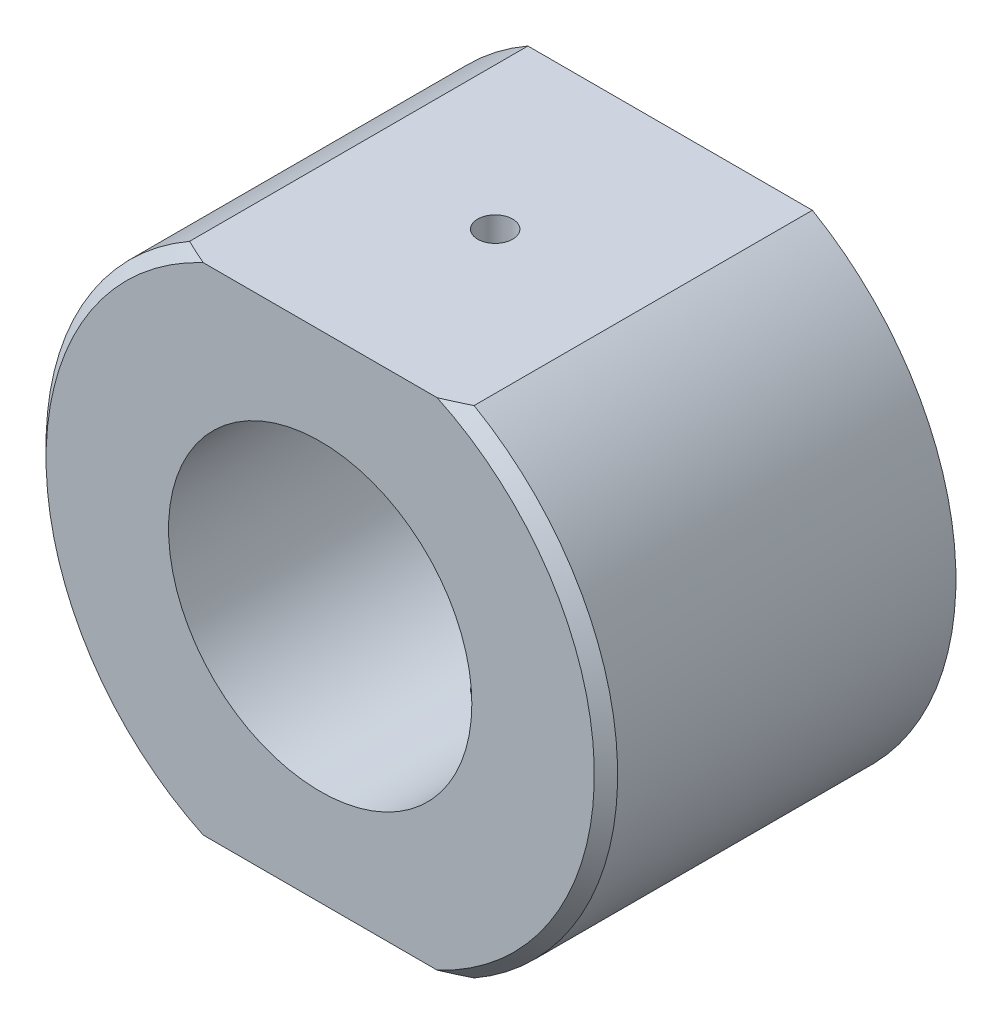
ISO-10303-21;
HEADER;
FILE_DESCRIPTION(('STEP AP214'),'2;1');
FILE_NAME('part.step','',(''),(''),'','','');
FILE_SCHEMA(('AUTOMOTIVE_DESIGN { 1 0 10303 214 1 1 1 1 }'));
ENDSEC;
DATA;
#1=APPLICATION_CONTEXT('core data for automotive mechanical design processes');
#2=APPLICATION_PROTOCOL_DEFINITION('international standard','automotive_design',2000,#1);
#3=PRODUCT_CONTEXT('',#1,'mechanical');
#4=PRODUCT('Part','Part','',(#3));
#5=PRODUCT_RELATED_PRODUCT_CATEGORY('part','',(#4));
#6=PRODUCT_DEFINITION_FORMATION('','',#4);
#7=PRODUCT_DEFINITION_CONTEXT('part definition',#1,'design');
#8=PRODUCT_DEFINITION('design','',#6,#7);
#9=PRODUCT_DEFINITION_SHAPE('','',#8);
#10=(LENGTH_UNIT() NAMED_UNIT(*) SI_UNIT(.MILLI.,.METRE.));
#11=(NAMED_UNIT(*) PLANE_ANGLE_UNIT() SI_UNIT($,.RADIAN.));
#12=(NAMED_UNIT(*) SI_UNIT($,.STERADIAN.) SOLID_ANGLE_UNIT());
#13=UNCERTAINTY_MEASURE_WITH_UNIT(LENGTH_MEASURE(1.E-05),#10,'distance_accuracy_value','');
#14=(GEOMETRIC_REPRESENTATION_CONTEXT(3) GLOBAL_UNCERTAINTY_ASSIGNED_CONTEXT((#13)) GLOBAL_UNIT_ASSIGNED_CONTEXT((#10,
#11,#12)) REPRESENTATION_CONTEXT('',''));
#15=CARTESIAN_POINT('',(0.,0.,0.));
#16=DIRECTION('',(0.,0.,1.));
#17=DIRECTION('',(1.,0.,0.));
#18=AXIS2_PLACEMENT_3D('',#15,#16,#17);
#19=CARTESIAN_POINT('',(0.,0.,60.));
#20=DIRECTION('',(0.,0.,1.));
#21=DIRECTION('',(1.,0.,0.));
#22=AXIS2_PLACEMENT_3D('',#19,#20,#21);
#23=PLANE('',#22);
#24=DIRECTION('',(1.,0.,0.));
#25=VECTOR('',#24,1.);
#26=CARTESIAN_POINT('',(24.3874967965144,-42.5,60.));
#27=LINE('',#26,#25);
#28=CARTESIAN_POINT('',(-20.0686322403894,-42.5,60.));
#29=VERTEX_POINT('',#28);
#30=CARTESIAN_POINT('',(20.0686322403894,-42.5,60.));
#31=VERTEX_POINT('',#30);
#32=EDGE_CURVE('E135',#29,#31,#27,.T.);
#33=ORIENTED_EDGE('',*,*,#32,.T.);
#34=CARTESIAN_POINT('',(0.,0.,60.));
#35=DIRECTION('',(0.,0.,1.));
#36=DIRECTION('',(1.,0.,0.));
#37=AXIS2_PLACEMENT_3D('',#34,#35,#36);
#38=CIRCLE('',#37,47.);
#39=CARTESIAN_POINT('',(20.0686322403894,42.5,60.));
#40=VERTEX_POINT('',#39);
#41=EDGE_CURVE('E142',#31,#40,#38,.T.);
#42=ORIENTED_EDGE('',*,*,#41,.T.);
#43=DIRECTION('',(-1.,0.,0.));
#44=VECTOR('',#43,1.);
#45=CARTESIAN_POINT('',(-24.3874967965144,42.5,60.));
#46=LINE('',#45,#44);
#47=CARTESIAN_POINT('',(-20.0686322403894,42.5,60.));
#48=VERTEX_POINT('',#47);
#49=EDGE_CURVE('E129',#40,#48,#46,.T.);
#50=ORIENTED_EDGE('',*,*,#49,.T.);
#51=CARTESIAN_POINT('',(0.,0.,60.));
#52=DIRECTION('',(0.,0.,1.));
#53=DIRECTION('',(1.,0.,0.));
#54=AXIS2_PLACEMENT_3D('',#51,#52,#53);
#55=CIRCLE('',#54,47.);
#56=EDGE_CURVE('E107',#48,#29,#55,.T.);
#57=ORIENTED_EDGE('',*,*,#56,.T.);
#58=EDGE_LOOP('',(#33,#42,#50,#57));
#59=FACE_BOUND('',#58,.T.);
#60=CARTESIAN_POINT('',(0.,0.,60.));
#61=DIRECTION('',(0.,0.,1.));
#62=DIRECTION('',(1.,0.,0.));
#63=AXIS2_PLACEMENT_3D('',#60,#61,#62);
#64=CIRCLE('',#63,26.);
#65=CARTESIAN_POINT('',(26.,0.,60.));
#66=VERTEX_POINT('',#65);
#67=EDGE_CURVE('E123',#66,#66,#64,.T.);
#68=ORIENTED_EDGE('',*,*,#67,.F.);
#69=EDGE_LOOP('',(#68));
#70=FACE_BOUND('',#69,.T.);
#71=ADVANCED_FACE('F39',(#59,#70),#23,.T.);
#72=CARTESIAN_POINT('',(0.,0.,0.));
#73=DIRECTION('',(0.,0.,1.));
#74=DIRECTION('',(1.,0.,0.));
#75=AXIS2_PLACEMENT_3D('',#72,#73,#74);
#76=PLANE('',#75);
#77=CARTESIAN_POINT('',(0.,0.,0.));
#78=DIRECTION('',(0.,0.,1.));
#79=DIRECTION('',(1.,0.,0.));
#80=AXIS2_PLACEMENT_3D('',#77,#78,#79);
#81=CIRCLE('',#80,49.);
#82=CARTESIAN_POINT('',(-24.3874967965144,42.5,0.));
#83=VERTEX_POINT('',#82);
#84=CARTESIAN_POINT('',(-24.3874967965143,-42.5,0.));
#85=VERTEX_POINT('',#84);
#86=EDGE_CURVE('E115',#83,#85,#81,.T.);
#87=ORIENTED_EDGE('',*,*,#86,.F.);
#88=DIRECTION('',(-1.,0.,0.));
#89=VECTOR('',#88,1.);
#90=CARTESIAN_POINT('',(-24.3874967965144,42.5,0.));
#91=LINE('',#90,#89);
#92=CARTESIAN_POINT('',(24.3874967965144,42.5,0.));
#93=VERTEX_POINT('',#92);
#94=EDGE_CURVE('E133',#93,#83,#91,.T.);
#95=ORIENTED_EDGE('',*,*,#94,.F.);
#96=CARTESIAN_POINT('',(0.,0.,0.));
#97=DIRECTION('',(0.,0.,1.));
#98=DIRECTION('',(1.,0.,0.));
#99=AXIS2_PLACEMENT_3D('',#96,#97,#98);
#100=CIRCLE('',#99,49.);
#101=CARTESIAN_POINT('',(24.3874967965144,-42.5,0.));
#102=VERTEX_POINT('',#101);
#103=EDGE_CURVE('E117',#102,#93,#100,.T.);
#104=ORIENTED_EDGE('',*,*,#103,.F.);
#105=DIRECTION('',(1.,0.,0.));
#106=VECTOR('',#105,1.);
#107=CARTESIAN_POINT('',(24.3874967965144,-42.5,0.));
#108=LINE('',#107,#106);
#109=EDGE_CURVE('E102',#85,#102,#108,.T.);
#110=ORIENTED_EDGE('',*,*,#109,.F.);
#111=EDGE_LOOP('',(#87,#95,#104,#110));
#112=FACE_BOUND('',#111,.T.);
#113=CARTESIAN_POINT('',(0.,0.,0.));
#114=DIRECTION('',(0.,0.,1.));
#115=DIRECTION('',(1.,0.,0.));
#116=AXIS2_PLACEMENT_3D('',#113,#114,#115);
#117=CIRCLE('',#116,26.);
#118=CARTESIAN_POINT('',(26.,0.,0.));
#119=VERTEX_POINT('',#118);
#120=EDGE_CURVE('E126',#119,#119,#117,.T.);
#121=ORIENTED_EDGE('',*,*,#120,.T.);
#122=EDGE_LOOP('',(#121));
#123=FACE_BOUND('',#122,.T.);
#124=ADVANCED_FACE('F112',(#112,#123),#76,.F.);
#125=CARTESIAN_POINT('',(0.,0.,60.));
#126=DIRECTION('',(0.,0.,-1.));
#127=DIRECTION('',(-1.,0.,0.));
#128=AXIS2_PLACEMENT_3D('',#125,#126,#127);
#129=CYLINDRICAL_SURFACE('',#128,49.);
#130=DIRECTION('',(0.,0.,-1.));
#131=VECTOR('',#130,1.);
#132=CARTESIAN_POINT('',(-24.3874967965143,-42.5,60.));
#133=LINE('',#132,#131);
#134=CARTESIAN_POINT('',(-24.3874967965143,-42.5,58.));
#135=VERTEX_POINT('',#134);
#136=EDGE_CURVE('E99',#135,#85,#133,.T.);
#137=ORIENTED_EDGE('',*,*,#136,.F.);
#138=CARTESIAN_POINT('',(0.,0.,58.));
#139=DIRECTION('',(0.,0.,1.));
#140=DIRECTION('',(1.,0.,0.));
#141=AXIS2_PLACEMENT_3D('',#138,#139,#140);
#142=CIRCLE('',#141,49.);
#143=CARTESIAN_POINT('',(-24.3874967965144,42.5,58.));
#144=VERTEX_POINT('',#143);
#145=EDGE_CURVE('E11',#135,#144,#142,.F.);
#146=ORIENTED_EDGE('',*,*,#145,.T.);
#147=DIRECTION('',(0.,0.,-1.));
#148=VECTOR('',#147,1.);
#149=CARTESIAN_POINT('',(-24.3874967965144,42.5,60.));
#150=LINE('',#149,#148);
#151=EDGE_CURVE('E121',#144,#83,#150,.T.);
#152=ORIENTED_EDGE('',*,*,#151,.T.);
#153=ORIENTED_EDGE('',*,*,#86,.T.);
#154=EDGE_LOOP('',(#137,#146,#152,#153));
#155=FACE_BOUND('',#154,.T.);
#156=ADVANCED_FACE('F119',(#155),#129,.T.);
#157=CARTESIAN_POINT('',(24.3874967965144,-42.5,60.));
#158=DIRECTION('',(0.,1.,0.));
#159=DIRECTION('',(0.,0.,1.));
#160=AXIS2_PLACEMENT_3D('',#157,#158,#159);
#161=PLANE('',#160);
#162=CARTESIAN_POINT('',(0.,-42.5,30.));
#163=DIRECTION('',(0.,1.,0.));
#164=DIRECTION('',(-1.,0.,0.));
#165=AXIS2_PLACEMENT_3D('',#162,#163,#164);
#166=CIRCLE('',#165,3.);
#167=CARTESIAN_POINT('',(-2.99999999999998,-42.5,30.));
#168=VERTEX_POINT('',#167);
#169=EDGE_CURVE('E216',#168,#168,#166,.T.);
#170=ORIENTED_EDGE('',*,*,#169,.T.);
#171=EDGE_LOOP('',(#170));
#172=FACE_BOUND('',#171,.T.);
#173=DIRECTION('',(0.,0.,-1.));
#174=VECTOR('',#173,1.);
#175=CARTESIAN_POINT('',(24.3874967965144,-42.5,60.));
#176=LINE('',#175,#174);
#177=CARTESIAN_POINT('',(24.3874967965144,-42.5,58.));
#178=VERTEX_POINT('',#177);
#179=EDGE_CURVE('E108',#178,#102,#176,.T.);
#180=ORIENTED_EDGE('',*,*,#179,.F.);
#181=CARTESIAN_POINT('',(24.3874967965144,-42.5,58.));
#182=CARTESIAN_POINT('',(24.0323372337801,-42.5,58.1767620490189));
#183=CARTESIAN_POINT('',(23.6760171642293,-42.5,58.3512013810915));
#184=CARTESIAN_POINT('',(22.961078025307,-42.5,58.6951053028431));
#185=CARTESIAN_POINT('',(22.602459458859,-42.5,58.8645709383694));
#186=CARTESIAN_POINT('',(21.882789797981,-42.5,59.1982756671127));
#187=CARTESIAN_POINT('',(21.5217386688866,-42.5,59.3625146856579));
#188=CARTESIAN_POINT('',(20.7970887080778,-42.5,59.6854808569935));
#189=CARTESIAN_POINT('',(20.4334893528166,-42.5,59.8442068346773));
#190=CARTESIAN_POINT('',(20.0686322403894,-42.5,60.));
#191=B_SPLINE_CURVE_WITH_KNOTS('',3,(#181,#182,#183,#184,#185,#186,#187,#188,#189,#190),
.UNSPECIFIED.,.F.,.F.,(4,2,2,2,4),(0.,1.19014361104329,2.38003514426986,3.56994366962464,
4.76010428704089),.UNSPECIFIED.);
#192=EDGE_CURVE('E55',#178,#31,#191,.T.);
#193=ORIENTED_EDGE('',*,*,#192,.T.);
#194=ORIENTED_EDGE('',*,*,#32,.F.);
#195=CARTESIAN_POINT('',(-20.0686322403894,-42.5,60.));
#196=CARTESIAN_POINT('',(-20.4334893528166,-42.5,59.8442068346773));
#197=CARTESIAN_POINT('',(-20.7970887080777,-42.5,59.6854808569935));
#198=CARTESIAN_POINT('',(-21.5217386688866,-42.5,59.3625146856579));
#199=CARTESIAN_POINT('',(-21.882789797981,-42.5,59.1982756671127));
#200=CARTESIAN_POINT('',(-22.602459458859,-42.5,58.8645709383694));
#201=CARTESIAN_POINT('',(-22.9610780253069,-42.5,58.6951053028431));
#202=CARTESIAN_POINT('',(-23.6760171642293,-42.5,58.3512013810915));
#203=CARTESIAN_POINT('',(-24.0323372337801,-42.5,58.1767620490189));
#204=CARTESIAN_POINT('',(-24.3874967965144,-42.5,58.));
#205=B_SPLINE_CURVE_WITH_KNOTS('',3,(#195,#196,#197,#198,#199,#200,#201,#202,#203,#204),
.UNSPECIFIED.,.F.,.F.,(4,2,2,2,4),(0.,1.19016061741624,2.38006914277104,3.5699606759976,
4.7601042870409),.UNSPECIFIED.);
#206=EDGE_CURVE('E63',#29,#135,#205,.T.);
#207=ORIENTED_EDGE('',*,*,#206,.T.);
#208=ORIENTED_EDGE('',*,*,#136,.T.);
#209=ORIENTED_EDGE('',*,*,#109,.T.);
#210=EDGE_LOOP('',(#180,#193,#194,#207,#208,#209));
#211=FACE_BOUND('',#210,.T.);
#212=ADVANCED_FACE('F101',(#172,#211),#161,.F.);
#213=CARTESIAN_POINT('',(0.,0.,60.));
#214=DIRECTION('',(0.,0.,-1.));
#215=DIRECTION('',(-1.,0.,0.));
#216=AXIS2_PLACEMENT_3D('',#213,#214,#215);
#217=CYLINDRICAL_SURFACE('',#216,49.);
#218=DIRECTION('',(0.,0.,-1.));
#219=VECTOR('',#218,1.);
#220=CARTESIAN_POINT('',(24.3874967965144,42.5,60.));
#221=LINE('',#220,#219);
#222=CARTESIAN_POINT('',(24.3874967965144,42.5,58.));
#223=VERTEX_POINT('',#222);
#224=EDGE_CURVE('E137',#223,#93,#221,.T.);
#225=ORIENTED_EDGE('',*,*,#224,.F.);
#226=CARTESIAN_POINT('',(0.,0.,58.));
#227=DIRECTION('',(0.,0.,1.));
#228=DIRECTION('',(1.,0.,0.));
#229=AXIS2_PLACEMENT_3D('',#226,#227,#228);
#230=CIRCLE('',#229,49.);
#231=EDGE_CURVE('E71',#223,#178,#230,.F.);
#232=ORIENTED_EDGE('',*,*,#231,.T.);
#233=ORIENTED_EDGE('',*,*,#179,.T.);
#234=ORIENTED_EDGE('',*,*,#103,.T.);
#235=EDGE_LOOP('',(#225,#232,#233,#234));
#236=FACE_BOUND('',#235,.T.);
#237=ADVANCED_FACE('F164',(#236),#217,.T.);
#238=CARTESIAN_POINT('',(-24.3874967965144,42.5,60.));
#239=DIRECTION('',(0.,-1.,0.));
#240=DIRECTION('',(1.,0.,0.));
#241=AXIS2_PLACEMENT_3D('',#238,#239,#240);
#242=PLANE('',#241);
#243=CARTESIAN_POINT('',(0.,42.5,30.));
#244=DIRECTION('',(0.,-1.,0.));
#245=DIRECTION('',(1.,0.,0.));
#246=AXIS2_PLACEMENT_3D('',#243,#244,#245);
#247=CIRCLE('',#246,3.);
#248=CARTESIAN_POINT('',(3.,42.5,30.));
#249=VERTEX_POINT('',#248);
#250=EDGE_CURVE('E220',#249,#249,#247,.T.);
#251=ORIENTED_EDGE('',*,*,#250,.T.);
#252=EDGE_LOOP('',(#251));
#253=FACE_BOUND('',#252,.T.);
#254=ORIENTED_EDGE('',*,*,#49,.F.);
#255=CARTESIAN_POINT('',(20.0686322403894,42.5,60.));
#256=CARTESIAN_POINT('',(20.4334893528166,42.5,59.8442068346773));
#257=CARTESIAN_POINT('',(20.7970887080778,42.5,59.6854808569935));
#258=CARTESIAN_POINT('',(21.5217386688866,42.5,59.3625146856579));
#259=CARTESIAN_POINT('',(21.882789797981,42.5,59.1982756671127));
#260=CARTESIAN_POINT('',(22.602459458859,42.5,58.8645709383694));
#261=CARTESIAN_POINT('',(22.961078025307,42.5,58.6951053028431));
#262=CARTESIAN_POINT('',(23.6760171642293,42.5,58.3512013810915));
#263=CARTESIAN_POINT('',(24.0323372337802,42.5,58.1767620490189));
#264=CARTESIAN_POINT('',(24.3874967965144,42.5,58.));
#265=B_SPLINE_CURVE_WITH_KNOTS('',3,(#255,#256,#257,#258,#259,#260,#261,#262,#263,#264),
.UNSPECIFIED.,.F.,.F.,(4,2,2,2,4),(0.,1.19016061741624,2.38006914277103,3.5699606759976,
4.76010428704089),.UNSPECIFIED.);
#266=EDGE_CURVE('E152',#40,#223,#265,.T.);
#267=ORIENTED_EDGE('',*,*,#266,.T.);
#268=ORIENTED_EDGE('',*,*,#224,.T.);
#269=ORIENTED_EDGE('',*,*,#94,.T.);
#270=ORIENTED_EDGE('',*,*,#151,.F.);
#271=CARTESIAN_POINT('',(-24.3874967965144,42.5,58.));
#272=CARTESIAN_POINT('',(-24.0323372337802,42.5,58.1767620490189));
#273=CARTESIAN_POINT('',(-23.6760171642293,42.5,58.3512013810915));
#274=CARTESIAN_POINT('',(-22.961078025307,42.5,58.6951053028431));
#275=CARTESIAN_POINT('',(-22.602459458859,42.5,58.8645709383694));
#276=CARTESIAN_POINT('',(-21.882789797981,42.5,59.1982756671127));
#277=CARTESIAN_POINT('',(-21.5217386688866,42.5,59.3625146856579));
#278=CARTESIAN_POINT('',(-20.7970887080778,42.5,59.6854808569935));
#279=CARTESIAN_POINT('',(-20.4334893528166,42.5,59.8442068346773));
#280=CARTESIAN_POINT('',(-20.0686322403894,42.5,60.));
#281=B_SPLINE_CURVE_WITH_KNOTS('',3,(#271,#272,#273,#274,#275,#276,#277,#278,#279,#280),
.UNSPECIFIED.,.F.,.F.,(4,2,2,2,4),(0.,1.19014361104329,2.38003514426986,3.56994366962465,
4.76010428704089),.UNSPECIFIED.);
#282=EDGE_CURVE('E145',#144,#48,#281,.T.);
#283=ORIENTED_EDGE('',*,*,#282,.T.);
#284=EDGE_LOOP('',(#254,#267,#268,#269,#270,#283));
#285=FACE_BOUND('',#284,.T.);
#286=ADVANCED_FACE('F158',(#253,#285),#242,.F.);
#287=CARTESIAN_POINT('',(0.,0.,60.));
#288=DIRECTION('',(0.,0.,-1.));
#289=DIRECTION('',(-1.,0.,0.));
#290=AXIS2_PLACEMENT_3D('',#287,#288,#289);
#291=CYLINDRICAL_SURFACE('',#290,26.);
#292=CARTESIAN_POINT('',(-2.99999999999998,-25.8263431402899,30.));
#293=CARTESIAN_POINT('',(-2.9999928026177,-25.8263453861448,30.167908434608));
#294=CARTESIAN_POINT('',(-2.98585584873549,-25.8279982763273,30.335924313317));
#295=CARTESIAN_POINT('',(-2.92968016609063,-25.8344294017294,30.667287404716));
#296=CARTESIAN_POINT('',(-2.88761162694887,-25.8392109760021,30.8306294346837));
#297=CARTESIAN_POINT('',(-2.77682317518229,-25.8513508162271,31.1477988297587));
#298=CARTESIAN_POINT('',(-2.70812055713957,-25.8587074098151,31.3016322941591));
#299=CARTESIAN_POINT('',(-2.54604970226084,-25.8751663568032,31.5955551150366));
#300=CARTESIAN_POINT('',(-2.452685961312,-25.884268391915,31.7356469703232));
#301=CARTESIAN_POINT('',(-2.24346352917514,-25.9032414911568,31.9988115528774));
#302=CARTESIAN_POINT('',(-2.12751042936062,-25.9131156749155,32.12180900593));
#303=CARTESIAN_POINT('',(-1.8766035279646,-25.9324923496423,32.3466439049662));
#304=CARTESIAN_POINT('',(-1.74164881339433,-25.9419948227224,32.4484803336234));
#305=CARTESIAN_POINT('',(-1.45610066266391,-25.9595889514983,32.6283689355143));
#306=CARTESIAN_POINT('',(-1.30546437735044,-25.9676765707205,32.7063535200464));
#307=CARTESIAN_POINT('',(-0.993125178942889,-25.9814955695482,32.8358920584034));
#308=CARTESIAN_POINT('',(-0.831422618686434,-25.987227024237,32.8874468544723));
#309=CARTESIAN_POINT('',(-0.502307805668705,-25.9956659677823,32.9624389330782));
#310=CARTESIAN_POINT('',(-0.334924304055214,-25.998386858357,32.9860008625163));
#311=CARTESIAN_POINT('',(0.00144174403430699,-26.0005437977897,33.0047244176383));
#312=CARTESIAN_POINT('',(0.170424236203077,-25.9999799578116,32.9998870044302));
#313=CARTESIAN_POINT('',(0.504344196297878,-25.995641858739,32.9620496093359));
#314=CARTESIAN_POINT('',(0.669297079485751,-25.9918828804027,32.9291836714748));
#315=CARTESIAN_POINT('',(0.99133011151122,-25.9815941760388,32.836431415623));
#316=CARTESIAN_POINT('',(1.14841012965622,-25.9750644040321,32.7765446492411));
#317=CARTESIAN_POINT('',(1.45065658648147,-25.9599416366636,32.6313063434388));
#318=CARTESIAN_POINT('',(1.59579464637944,-25.9513439068472,32.5458962596621));
#319=CARTESIAN_POINT('',(1.86972764203845,-25.933048305862,32.3520783491596));
#320=CARTESIAN_POINT('',(1.99852193866128,-25.9233503916976,32.243669623493));
#321=CARTESIAN_POINT('',(2.23689794843258,-25.9038742999407,32.0061797055174));
#322=CARTESIAN_POINT('',(2.34636338180816,-25.8940959838645,31.8769817778366));
#323=CARTESIAN_POINT('',(2.54207205355705,-25.8756171602045,31.6019834410564));
#324=CARTESIAN_POINT('',(2.62831523716949,-25.8669166551624,31.4561829928075));
#325=CARTESIAN_POINT('',(2.7751349564045,-25.8515783541127,31.1520206049999));
#326=CARTESIAN_POINT('',(2.83570305454275,-25.8449412363773,30.993654556332));
#327=CARTESIAN_POINT('',(2.92935475749396,-25.8344947945169,30.6689062467948));
#328=CARTESIAN_POINT('',(2.96243948516282,-25.8306853548655,30.502524313715));
#329=CARTESIAN_POINT('',(3.00003311848414,-25.8263463096429,30.1674916465916));
#330=CARTESIAN_POINT('',(3.0047052680509,-25.8257979678994,29.998859463132));
#331=CARTESIAN_POINT('',(2.98577101906255,-25.8279937023154,29.6632147261314));
#332=CARTESIAN_POINT('',(2.96216513214295,-25.8307377189062,29.4962021433422));
#333=CARTESIAN_POINT('',(2.88748198909646,-25.839191917833,29.169021180821));
#334=CARTESIAN_POINT('',(2.83648301504278,-25.8448936462424,29.0088346950225));
#335=CARTESIAN_POINT('',(2.70854167827264,-25.8586139831724,28.6992880939006));
#336=CARTESIAN_POINT('',(2.6315985327847,-25.8666326615976,28.5499283053989));
#337=CARTESIAN_POINT('',(2.45354851579354,-25.8841284862813,28.2655340411651));
#338=CARTESIAN_POINT('',(2.35233413088689,-25.8936120530368,28.1305672773883));
#339=CARTESIAN_POINT('',(2.12876758717274,-25.9129486068736,27.8794794155517));
#340=CARTESIAN_POINT('',(2.00641472969629,-25.9228016061569,27.7633589406457));
#341=CARTESIAN_POINT('',(1.74333328233746,-25.9418240063614,27.5526907512452));
#342=CARTESIAN_POINT('',(1.60251875694191,-25.9509898740538,27.4582499884546));
#343=CARTESIAN_POINT('',(1.30693176308019,-25.9675530338705,27.2943604060751));
#344=CARTESIAN_POINT('',(1.15215953982995,-25.9749503570571,27.2249111475296));
#345=CARTESIAN_POINT('',(0.833413298815677,-25.9871271682,27.1131544955329));
#346=CARTESIAN_POINT('',(0.669461593442491,-25.9919127238746,27.0707841521801));
#347=CARTESIAN_POINT('',(0.336712541191538,-25.9983518803126,27.0141829982935));
#348=CARTESIAN_POINT('',(0.167915379166326,-26.0000056003938,26.9999511157304));
#349=CARTESIAN_POINT('',(-0.168686252828111,-25.9999944027311,27.0000488551691));
#350=CARTESIAN_POINT('',(-0.336490795680584,-25.9983486992846,27.0142131113358));
#351=CARTESIAN_POINT('',(-0.667318433893675,-25.9919616193875,27.0703522443946));
#352=CARTESIAN_POINT('',(-0.830341529361762,-25.9872202430065,27.1123271206617));
#353=CARTESIAN_POINT('',(-1.14696521143171,-25.9751724852275,27.2228464871378));
#354=CARTESIAN_POINT('',(-1.30056815693994,-25.9678667490787,27.2913842939796));
#355=CARTESIAN_POINT('',(-1.59411760600613,-25.9515014514924,27.4530667971226));
#356=CARTESIAN_POINT('',(-1.73406404544358,-25.9424418818208,27.5462116089517));
#357=CARTESIAN_POINT('',(-1.99717419009734,-25.9235186521466,27.7550798330632));
#358=CARTESIAN_POINT('',(-2.12023979904699,-25.9136507839086,27.8709264407956));
#359=CARTESIAN_POINT('',(-2.34525190589056,-25.8942577229242,28.1216574549047));
#360=CARTESIAN_POINT('',(-2.44719337037138,-25.884732612295,28.2565463857993));
#361=CARTESIAN_POINT('',(-2.62734429502595,-25.8670699432557,28.5420370747978));
#362=CARTESIAN_POINT('',(-2.70547416690813,-25.8589370771561,28.6926893149998));
#363=CARTESIAN_POINT('',(-2.8352184121186,-25.8450349719236,29.0049801599057));
#364=CARTESIAN_POINT('',(-2.8868620646037,-25.8392631242413,29.1666064085287));
#365=CARTESIAN_POINT('',(-2.94959141704635,-25.8321603911481,29.4409188569927));
#366=CARTESIAN_POINT('',(-2.96846801324267,-25.8299895587472,29.5518645439028));
#367=CARTESIAN_POINT('',(-2.99367467611827,-25.8270801857883,29.7751907691413));
#368=CARTESIAN_POINT('',(-3.00000481924771,-25.8263416365028,29.8875712987226));
#369=CARTESIAN_POINT('',(-2.99999999999998,-25.8263431402899,30.));
#370=B_SPLINE_CURVE_WITH_KNOTS('',3,(#292,#293,#294,#295,#296,#297,#298,#299,#300,#301,#302,
#303,#304,#305,#306,#307,#308,#309,#310,#311,#312,#313,#314,#315,#316,#317,#318,#319,#320,#321,
#322,#323,#324,#325,#326,#327,#328,#329,#330,#331,#332,#333,#334,#335,#336,#337,#338,#339,#340,
#341,#342,#343,#344,#345,#346,#347,#348,#349,#350,#351,#352,#353,#354,#355,#356,#357,#358,#359,
#360,#361,#362,#363,#364,#365,#366,#367,#368,#369),.UNSPECIFIED.,.T.,.F.,(4,2,2,2,2,2,2,2,2,2,2,
2,2,2,2,2,2,2,2,2,2,2,2,2,2,2,2,2,2,2,2,2,2,2,2,2,2,2,4),(0.,0.503314647421852,1.0071673298394,
1.51069338690943,2.01412771110221,2.51971303355875,3.02532265665233,3.53235202214447,
4.03936522901343,4.54411223851369,5.04884216615195,5.55117171583685,6.05350960162559,
6.55700869150204,7.06052746511872,7.5669791481549,8.07343202545449,8.58005120723227,
9.08664968964506,9.5903347492287,10.0940106957588,10.5962548708812,11.0985142007601,
11.6030408609301,12.1075841999106,12.6145655127327,13.1215379203843,13.6273274492139,
14.1330977079183,14.6359311529625,15.1387645867048,15.6414715870719,16.144180947653,
16.6496979250847,17.1553352177946,17.6626444809948,18.1693917244587,18.5064049131306,
18.8434160482511),.UNSPECIFIED.);
#371=CARTESIAN_POINT('',(-2.99999999999998,-25.8263431402899,30.));
#372=VERTEX_POINT('',#371);
#373=EDGE_CURVE('E45',#372,#372,#370,.T.);
#374=ORIENTED_EDGE('',*,*,#373,.F.);
#375=EDGE_LOOP('',(#374));
#376=FACE_BOUND('',#375,.T.);
#377=CARTESIAN_POINT('',(-3.,25.8263431402899,30.));
#378=CARTESIAN_POINT('',(-2.99999280261772,25.8263453861448,29.832091565392));
#379=CARTESIAN_POINT('',(-2.98585584873551,25.8279982763273,29.664075686683));
#380=CARTESIAN_POINT('',(-2.92968016609064,25.8344294017294,29.332712595284));
#381=CARTESIAN_POINT('',(-2.88761162694888,25.8392109760021,29.1693705653163));
#382=CARTESIAN_POINT('',(-2.77682317518231,25.8513508162271,28.8522011702413));
#383=CARTESIAN_POINT('',(-2.70812055713959,25.8587074098151,28.6983677058409));
#384=CARTESIAN_POINT('',(-2.54604970226085,25.8751663568032,28.4044448849634));
#385=CARTESIAN_POINT('',(-2.45268596131201,25.884268391915,28.2643530296768));
#386=CARTESIAN_POINT('',(-2.24346352917516,25.9032414911568,28.0011884471226));
#387=CARTESIAN_POINT('',(-2.12751042936064,25.9131156749155,27.87819099407));
#388=CARTESIAN_POINT('',(-1.87660352796462,25.9324923496423,27.6533560950338));
#389=CARTESIAN_POINT('',(-1.74164881339435,25.9419948227224,27.5515196663766));
#390=CARTESIAN_POINT('',(-1.45610066266393,25.9595889514983,27.3716310644857));
#391=CARTESIAN_POINT('',(-1.30546437735046,25.9676765707205,27.2936464799536));
#392=CARTESIAN_POINT('',(-0.993125178942906,25.9814955695482,27.1641079415966));
#393=CARTESIAN_POINT('',(-0.831422618686452,25.987227024237,27.1125531455277));
#394=CARTESIAN_POINT('',(-0.502307805668722,25.9956659677823,27.0375610669218));
#395=CARTESIAN_POINT('',(-0.334924304055232,25.998386858357,27.0139991374837));
#396=CARTESIAN_POINT('',(0.00144174403428799,26.0005437977897,26.9952755823617));
#397=CARTESIAN_POINT('',(0.170424236203058,25.9999799578116,27.0001129955698));
#398=CARTESIAN_POINT('',(0.504344196297858,25.995641858739,27.0379503906641));
#399=CARTESIAN_POINT('',(0.669297079485731,25.9918828804027,27.0708163285252));
#400=CARTESIAN_POINT('',(0.991330111511201,25.9815941760388,27.163568584377));
#401=CARTESIAN_POINT('',(1.14841012965621,25.9750644040321,27.2234553507589));
#402=CARTESIAN_POINT('',(1.45065658648145,25.9599416366636,27.3686936565612));
#403=CARTESIAN_POINT('',(1.59579464637943,25.9513439068472,27.4541037403379));
#404=CARTESIAN_POINT('',(1.86972764203843,25.933048305862,27.6479216508404));
#405=CARTESIAN_POINT('',(1.99852193866127,25.9233503916976,27.756330376507));
#406=CARTESIAN_POINT('',(2.23689794843256,25.9038742999407,27.9938202944826));
#407=CARTESIAN_POINT('',(2.34636338180814,25.8940959838645,28.1230182221634));
#408=CARTESIAN_POINT('',(2.54207205355703,25.8756171602045,28.3980165589436));
#409=CARTESIAN_POINT('',(2.62831523716948,25.8669166551624,28.5438170071925));
#410=CARTESIAN_POINT('',(2.77513495640449,25.8515783541127,28.8479793950001));
#411=CARTESIAN_POINT('',(2.83570305454274,25.8449412363773,29.006345443668));
#412=CARTESIAN_POINT('',(2.92935475749395,25.8344947945169,29.3310937532052));
#413=CARTESIAN_POINT('',(2.9624394851628,25.8306853548655,29.497475686285));
#414=CARTESIAN_POINT('',(3.00003311848412,25.8263463096429,29.8325083534084));
#415=CARTESIAN_POINT('',(3.00470526805088,25.8257979678994,30.001140536868));
#416=CARTESIAN_POINT('',(2.98577101906254,25.8279937023154,30.3367852738686));
#417=CARTESIAN_POINT('',(2.96216513214293,25.8307377189062,30.5037978566578));
#418=CARTESIAN_POINT('',(2.88748198909645,25.839191917833,30.830978819179));
#419=CARTESIAN_POINT('',(2.83648301504276,25.8448936462424,30.9911653049775));
#420=CARTESIAN_POINT('',(2.70854167827263,25.8586139831724,31.3007119060994));
#421=CARTESIAN_POINT('',(2.63159853278469,25.8666326615976,31.4500716946011));
#422=CARTESIAN_POINT('',(2.45354851579353,25.8841284862813,31.7344659588349));
#423=CARTESIAN_POINT('',(2.35233413088688,25.8936120530368,31.8694327226117));
#424=CARTESIAN_POINT('',(2.12876758717274,25.9129486068736,32.1205205844483));
#425=CARTESIAN_POINT('',(2.00641472969628,25.9228016061569,32.2366410593543));
#426=CARTESIAN_POINT('',(1.74333328233745,25.9418240063614,32.4473092487548));
#427=CARTESIAN_POINT('',(1.60251875694189,25.9509898740538,32.5417500115454));
#428=CARTESIAN_POINT('',(1.30693176308018,25.9675530338705,32.7056395939249));
#429=CARTESIAN_POINT('',(1.15215953982994,25.9749503570571,32.7750888524704));
#430=CARTESIAN_POINT('',(0.833413298815665,25.9871271682,32.8868455044671));
#431=CARTESIAN_POINT('',(0.669461593442479,25.9919127238746,32.92921584782));
#432=CARTESIAN_POINT('',(0.336712541191526,25.9983518803126,32.9858170017065));
#433=CARTESIAN_POINT('',(0.167915379166314,26.0000056003938,33.0000488842696));
#434=CARTESIAN_POINT('',(-0.168686252828122,25.9999944027311,32.9999511448309));
#435=CARTESIAN_POINT('',(-0.336490795680595,25.9983486992846,32.9857868886642));
#436=CARTESIAN_POINT('',(-0.667318433893687,25.9919616193875,32.9296477556054));
#437=CARTESIAN_POINT('',(-0.830341529361774,25.9872202430065,32.8876728793383));
#438=CARTESIAN_POINT('',(-1.14696521143172,25.9751724852275,32.7771535128623));
#439=CARTESIAN_POINT('',(-1.30056815693995,25.9678667490787,32.7086157060204));
#440=CARTESIAN_POINT('',(-1.59411760600614,25.9515014514924,32.5469332028774));
#441=CARTESIAN_POINT('',(-1.73406404544359,25.9424418818208,32.4537883910484));
#442=CARTESIAN_POINT('',(-1.99717419009735,25.9235186521466,32.2449201669368));
#443=CARTESIAN_POINT('',(-2.120239799047,25.9136507839086,32.1290735592044));
#444=CARTESIAN_POINT('',(-2.34525190589057,25.8942577229242,31.8783425450954));
#445=CARTESIAN_POINT('',(-2.44719337037139,25.884732612295,31.7434536142007));
#446=CARTESIAN_POINT('',(-2.62734429502597,25.8670699432557,31.4579629252022));
#447=CARTESIAN_POINT('',(-2.70547416690814,25.8589370771561,31.3073106850002));
#448=CARTESIAN_POINT('',(-2.83521841211861,25.8450349719236,30.9950198400943));
#449=CARTESIAN_POINT('',(-2.88686206460371,25.8392631242413,30.8333935914713));
#450=CARTESIAN_POINT('',(-2.94959141704636,25.8321603911481,30.5590811430073));
#451=CARTESIAN_POINT('',(-2.96846801324268,25.8299895587472,30.4481354560972));
#452=CARTESIAN_POINT('',(-2.99367467611829,25.8270801857883,30.2248092308587));
#453=CARTESIAN_POINT('',(-3.00000481924773,25.8263416365028,30.1124287012774));
#454=CARTESIAN_POINT('',(-3.,25.8263431402899,30.));
#455=B_SPLINE_CURVE_WITH_KNOTS('',3,(#377,#378,#379,#380,#381,#382,#383,#384,#385,#386,#387,
#388,#389,#390,#391,#392,#393,#394,#395,#396,#397,#398,#399,#400,#401,#402,#403,#404,#405,#406,
#407,#408,#409,#410,#411,#412,#413,#414,#415,#416,#417,#418,#419,#420,#421,#422,#423,#424,#425,
#426,#427,#428,#429,#430,#431,#432,#433,#434,#435,#436,#437,#438,#439,#440,#441,#442,#443,#444,
#445,#446,#447,#448,#449,#450,#451,#452,#453,#454),.UNSPECIFIED.,.T.,.F.,(4,2,2,2,2,2,2,2,2,2,2,
2,2,2,2,2,2,2,2,2,2,2,2,2,2,2,2,2,2,2,2,2,2,2,2,2,2,2,4),(0.,0.503314647421852,1.0071673298394,
1.51069338690943,2.01412771110221,2.51971303355874,3.02532265665232,3.53235202214447,
4.03936522901343,4.54411223851369,5.04884216615194,5.55117171583684,6.05350960162559,
6.55700869150203,7.06052746511872,7.5669791481549,8.07343202545448,8.58005120723228,
9.08664968964506,9.5903347492287,10.0940106957588,10.5962548708812,11.0985142007601,
11.6030408609301,12.1075841999106,12.6145655127327,13.1215379203843,13.6273274492139,
14.1330977079183,14.6359311529625,15.1387645867048,15.6414715870719,16.144180947653,
16.6496979250847,17.1553352177946,17.6626444809948,18.1693917244587,18.5064049131306,
18.8434160482511),.UNSPECIFIED.);
#456=CARTESIAN_POINT('',(-3.,25.8263431402899,30.));
#457=VERTEX_POINT('',#456);
#458=EDGE_CURVE('E211',#457,#457,#455,.T.);
#459=ORIENTED_EDGE('',*,*,#458,.F.);
#460=EDGE_LOOP('',(#459));
#461=FACE_BOUND('',#460,.T.);
#462=ORIENTED_EDGE('',*,*,#67,.T.);
#463=EDGE_LOOP('',(#462));
#464=FACE_BOUND('',#463,.T.);
#465=ORIENTED_EDGE('',*,*,#120,.F.);
#466=EDGE_LOOP('',(#465));
#467=FACE_BOUND('',#466,.T.);
#468=ADVANCED_FACE('F163',(#376,#461,#464,#467),#291,.F.);
#469=CARTESIAN_POINT('',(0.,0.,60.));
#470=DIRECTION('',(0.,0.,-1.));
#471=DIRECTION('',(-1.,0.,0.));
#472=AXIS2_PLACEMENT_3D('',#469,#470,#471);
#473=CONICAL_SURFACE('',#472,47.,0.785398163397447);
#474=ORIENTED_EDGE('',*,*,#192,.F.);
#475=ORIENTED_EDGE('',*,*,#231,.F.);
#476=ORIENTED_EDGE('',*,*,#266,.F.);
#477=ORIENTED_EDGE('',*,*,#41,.F.);
#478=EDGE_LOOP('',(#474,#475,#476,#477));
#479=FACE_BOUND('',#478,.T.);
#480=ADVANCED_FACE('F186',(#479),#473,.T.);
#481=CARTESIAN_POINT('',(0.,0.,60.));
#482=DIRECTION('',(0.,0.,-1.));
#483=DIRECTION('',(-1.,0.,0.));
#484=AXIS2_PLACEMENT_3D('',#481,#482,#483);
#485=CONICAL_SURFACE('',#484,47.,0.785398163397447);
#486=ORIENTED_EDGE('',*,*,#282,.F.);
#487=ORIENTED_EDGE('',*,*,#145,.F.);
#488=ORIENTED_EDGE('',*,*,#206,.F.);
#489=ORIENTED_EDGE('',*,*,#56,.F.);
#490=EDGE_LOOP('',(#486,#487,#488,#489));
#491=FACE_BOUND('',#490,.T.);
#492=ADVANCED_FACE('F42',(#491),#485,.T.);
#493=CARTESIAN_POINT('',(0.,-42.5,30.));
#494=DIRECTION('',(0.,1.,0.));
#495=DIRECTION('',(-1.,0.,0.));
#496=AXIS2_PLACEMENT_3D('',#493,#494,#495);
#497=CYLINDRICAL_SURFACE('',#496,3.);
#498=ORIENTED_EDGE('',*,*,#458,.T.);
#499=EDGE_LOOP('',(#498));
#500=FACE_BOUND('',#499,.T.);
#501=ORIENTED_EDGE('',*,*,#250,.F.);
#502=EDGE_LOOP('',(#501));
#503=FACE_BOUND('',#502,.T.);
#504=ADVANCED_FACE('F197',(#500,#503),#497,.F.);
#505=ORIENTED_EDGE('',*,*,#373,.T.);
#506=EDGE_LOOP('',(#505));
#507=FACE_BOUND('',#506,.T.);
#508=ORIENTED_EDGE('',*,*,#169,.F.);
#509=EDGE_LOOP('',(#508));
#510=FACE_BOUND('',#509,.T.);
#511=ADVANCED_FACE('F239',(#507,#510),#497,.F.);
#512=CLOSED_SHELL('',(#71,#124,#156,#212,#237,#286,#468,#480,#492,#504,#511));
#513=MANIFOLD_SOLID_BREP('B2',#512);
#514=ADVANCED_BREP_SHAPE_REPRESENTATION('',(#18,#513),#14);
#515=SHAPE_DEFINITION_REPRESENTATION(#9,#514);
ENDSEC;
END-ISO-10303-21;
